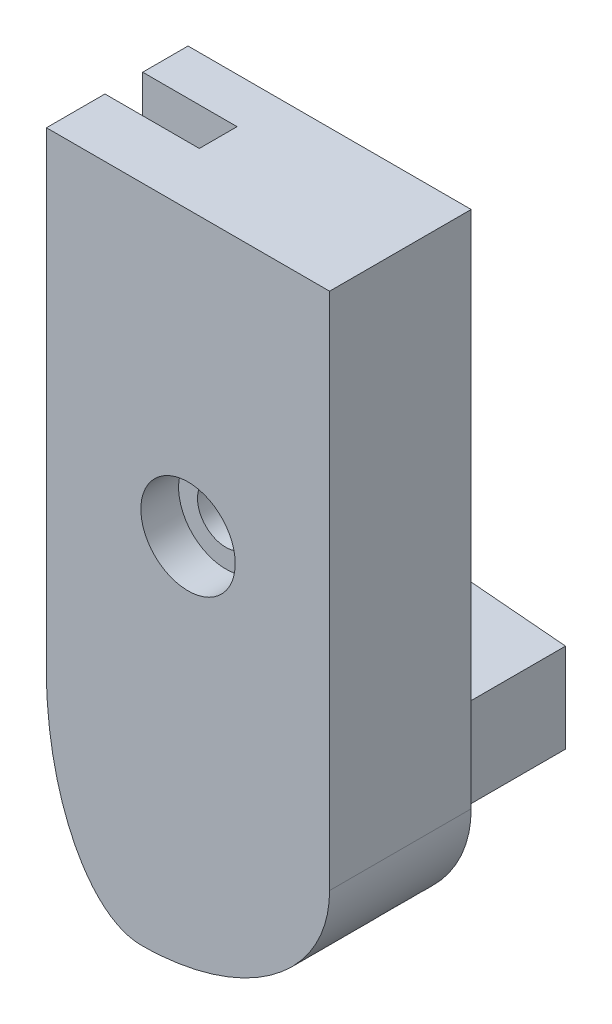
ISO-10303-21;
HEADER;
FILE_DESCRIPTION(('STEP AP214'),'2;1');
FILE_NAME('part.step','',(''),(''),'','','');
FILE_SCHEMA(('AUTOMOTIVE_DESIGN { 1 0 10303 214 1 1 1 1 }'));
ENDSEC;
DATA;
#1=APPLICATION_CONTEXT('core data for automotive mechanical design processes');
#2=APPLICATION_PROTOCOL_DEFINITION('international standard','automotive_design',2000,#1);
#3=PRODUCT_CONTEXT('',#1,'mechanical');
#4=PRODUCT('Part','Part','',(#3));
#5=PRODUCT_RELATED_PRODUCT_CATEGORY('part','',(#4));
#6=PRODUCT_DEFINITION_FORMATION('','',#4);
#7=PRODUCT_DEFINITION_CONTEXT('part definition',#1,'design');
#8=PRODUCT_DEFINITION('design','',#6,#7);
#9=PRODUCT_DEFINITION_SHAPE('','',#8);
#10=(LENGTH_UNIT() NAMED_UNIT(*) SI_UNIT(.MILLI.,.METRE.));
#11=(NAMED_UNIT(*) PLANE_ANGLE_UNIT() SI_UNIT($,.RADIAN.));
#12=(NAMED_UNIT(*) SI_UNIT($,.STERADIAN.) SOLID_ANGLE_UNIT());
#13=UNCERTAINTY_MEASURE_WITH_UNIT(LENGTH_MEASURE(1.E-05),#10,'distance_accuracy_value','');
#14=(GEOMETRIC_REPRESENTATION_CONTEXT(3) GLOBAL_UNCERTAINTY_ASSIGNED_CONTEXT((#13)) GLOBAL_UNIT_ASSIGNED_CONTEXT((#10,
#11,#12)) REPRESENTATION_CONTEXT('',''));
#15=CARTESIAN_POINT('',(0.,0.,0.));
#16=DIRECTION('',(0.,0.,1.));
#17=DIRECTION('',(1.,0.,0.));
#18=AXIS2_PLACEMENT_3D('',#15,#16,#17);
#19=CARTESIAN_POINT('',(-15.,30.,7.5));
#20=DIRECTION('',(1.,0.,0.));
#21=DIRECTION('',(0.,0.,-1.));
#22=AXIS2_PLACEMENT_3D('',#19,#20,#21);
#23=PLANE('',#22);
#24=DIRECTION('',(0.,-1.,0.));
#25=VECTOR('',#24,1.);
#26=CARTESIAN_POINT('',(-15.,30.,-7.5));
#27=LINE('',#26,#25);
#28=CARTESIAN_POINT('',(-15.,-0.0404464860069564,-7.5));
#29=VERTEX_POINT('',#28);
#30=CARTESIAN_POINT('',(-15.,-20.,-7.5));
#31=VERTEX_POINT('',#30);
#32=EDGE_CURVE('E312',#29,#31,#27,.T.);
#33=ORIENTED_EDGE('',*,*,#32,.T.);
#34=CARTESIAN_POINT('',(-15.,-20.,8.25));
#35=CARTESIAN_POINT('',(-15.,-20.,2.74999999999999));
#36=CARTESIAN_POINT('',(-15.,-20.,-2.75));
#37=CARTESIAN_POINT('',(-15.,-20.,-8.25));
#38=CARTESIAN_POINT('',(-15.,-20.,-10.042));
#39=CARTESIAN_POINT('',(-15.,-20.,-11.834));
#40=CARTESIAN_POINT('',(-15.,-20.,-13.626));
#41=(BOUNDED_CURVE() B_SPLINE_CURVE(3,(#34,#35,#36,#37,#38,#39,#40),.UNSPECIFIED.,.F.,
.F.) B_SPLINE_CURVE_WITH_KNOTS((4,3,4),(-0.021126,-0.00462600000000001,0.000750000000000001),
.UNSPECIFIED.) CURVE() GEOMETRIC_REPRESENTATION_ITEM() RATIONAL_B_SPLINE_CURVE((1.,1.,1.,1.,1.,
1.,1.)) REPRESENTATION_ITEM(''));
#42=CARTESIAN_POINT('',(-15.,-20.,-2.69593991600876));
#43=VERTEX_POINT('',#42);
#44=EDGE_CURVE('E643',#31,#43,#41,.F.);
#45=ORIENTED_EDGE('',*,*,#44,.T.);
#46=DIRECTION('',(0.,-1.,0.));
#47=VECTOR('',#46,1.);
#48=CARTESIAN_POINT('',(-15.,30.,-2.69593991600876));
#49=LINE('',#48,#47);
#50=CARTESIAN_POINT('',(-15.,30.,-2.69593991600876));
#51=VERTEX_POINT('',#50);
#52=EDGE_CURVE('E289',#51,#43,#49,.T.);
#53=ORIENTED_EDGE('',*,*,#52,.F.);
#54=DIRECTION('',(0.,0.,-1.));
#55=VECTOR('',#54,1.);
#56=CARTESIAN_POINT('',(-15.,30.,7.5));
#57=LINE('',#56,#55);
#58=CARTESIAN_POINT('',(-15.,30.,-7.5));
#59=VERTEX_POINT('',#58);
#60=EDGE_CURVE('E750',#51,#59,#57,.T.);
#61=ORIENTED_EDGE('',*,*,#60,.T.);
#62=CARTESIAN_POINT('',(-15.,1.36426817366125,-7.5));
#63=VERTEX_POINT('',#62);
#64=EDGE_CURVE('E316',#59,#63,#27,.T.);
#65=ORIENTED_EDGE('',*,*,#64,.T.);
#66=DIRECTION('',(0.,0.,-1.));
#67=VECTOR('',#66,1.);
#68=CARTESIAN_POINT('',(-15.,1.36426817366125,-4.5));
#69=LINE('',#68,#67);
#70=CARTESIAN_POINT('',(-15.,1.36426817366125,-4.5));
#71=VERTEX_POINT('',#70);
#72=EDGE_CURVE('E287',#71,#63,#69,.T.);
#73=ORIENTED_EDGE('',*,*,#72,.F.);
#74=DIRECTION('',(0.,-1.,0.));
#75=VECTOR('',#74,1.);
#76=CARTESIAN_POINT('',(-15.,1.36426817366125,-4.5));
#77=LINE('',#76,#75);
#78=CARTESIAN_POINT('',(-15.,-0.0404464860069564,-4.5));
#79=VERTEX_POINT('',#78);
#80=EDGE_CURVE('E774',#71,#79,#77,.T.);
#81=ORIENTED_EDGE('',*,*,#80,.T.);
#82=DIRECTION('',(0.,0.,-1.));
#83=VECTOR('',#82,1.);
#84=CARTESIAN_POINT('',(-15.,-0.0404464860069564,-4.5));
#85=LINE('',#84,#83);
#86=EDGE_CURVE('E284',#79,#29,#85,.T.);
#87=ORIENTED_EDGE('',*,*,#86,.T.);
#88=EDGE_LOOP('',(#33,#45,#53,#61,#65,#73,#81,#87));
#89=FACE_BOUND('',#88,.T.);
#90=ADVANCED_FACE('F41',(#89),#23,.F.);
#91=CARTESIAN_POINT('',(0.,0.,-7.5));
#92=DIRECTION('',(0.,0.,1.));
#93=DIRECTION('',(1.,0.,0.));
#94=AXIS2_PLACEMENT_3D('',#91,#92,#93);
#95=PLANE('',#94);
#96=DIRECTION('',(0.,1.,0.));
#97=VECTOR('',#96,1.);
#98=CARTESIAN_POINT('',(6.,0.,-7.5));
#99=LINE('',#98,#97);
#100=CARTESIAN_POINT('',(5.9999580452678,-37.5275960949757,-7.5));
#101=VERTEX_POINT('',#100);
#102=CARTESIAN_POINT('',(6.,-24.5713257105763,-7.5));
#103=VERTEX_POINT('',#102);
#104=EDGE_CURVE('E554',#101,#103,#99,.T.);
#105=ORIENTED_EDGE('',*,*,#104,.T.);
#106=DIRECTION('',(-0.996182927064009,0.0872901817284347,0.));
#107=VECTOR('',#106,1.);
#108=CARTESIAN_POINT('',(-2.09093103813967,-23.8623606987456,-7.5));
#109=LINE('',#108,#107);
#110=CARTESIAN_POINT('',(-14.9060970474752,-22.7393825602912,-7.5));
#111=VERTEX_POINT('',#110);
#112=EDGE_CURVE('E637',#103,#111,#109,.T.);
#113=ORIENTED_EDGE('',*,*,#112,.T.);
#114=CARTESIAN_POINT('',(-15.,-20.,-7.5));
#115=CARTESIAN_POINT('',(-15.,-40.,-7.5));
#116=CARTESIAN_POINT('',(-5.,-40.,-7.5));
#117=(BOUNDED_CURVE() B_SPLINE_CURVE(2,(#114,#115,#116),.UNSPECIFIED.,.F.,
.F.) B_SPLINE_CURVE_WITH_KNOTS((3,3),(0.,1.),
.UNSPECIFIED.) CURVE() GEOMETRIC_REPRESENTATION_ITEM() RATIONAL_B_SPLINE_CURVE((1.,
0.707106781186548,1.)) REPRESENTATION_ITEM(''));
#118=EDGE_CURVE('E623',#111,#31,#117,.F.);
#119=ORIENTED_EDGE('',*,*,#118,.T.);
#120=ORIENTED_EDGE('',*,*,#32,.F.);
#121=DIRECTION('',(0.939692620785908,-0.342020143325669,0.));
#122=VECTOR('',#121,1.);
#123=CARTESIAN_POINT('',(0.,-5.5,-7.5));
#124=LINE('',#123,#122);
#125=CARTESIAN_POINT('',(0.,-5.5,-7.5));
#126=VERTEX_POINT('',#125);
#127=EDGE_CURVE('E275',#29,#126,#124,.T.);
#128=ORIENTED_EDGE('',*,*,#127,.T.);
#129=DIRECTION('',(0.,1.,0.));
#130=VECTOR('',#129,1.);
#131=CARTESIAN_POINT('',(0.,-4.09528534033179,-7.5));
#132=LINE('',#131,#130);
#133=CARTESIAN_POINT('',(0.,-5.,-7.5));
#134=VERTEX_POINT('',#133);
#135=EDGE_CURVE('E264',#126,#134,#132,.T.);
#136=ORIENTED_EDGE('',*,*,#135,.T.);
#137=CARTESIAN_POINT('',(0.,0.,-7.5));
#138=DIRECTION('',(0.,0.,1.));
#139=DIRECTION('',(1.,0.,0.));
#140=AXIS2_PLACEMENT_3D('',#137,#138,#139);
#141=CIRCLE('',#140,5.);
#142=CARTESIAN_POINT('',(-4.31594114075766,-2.52441123225108,-7.5));
#143=VERTEX_POINT('',#142);
#144=EDGE_CURVE('E317',#134,#143,#141,.T.);
#145=ORIENTED_EDGE('',*,*,#144,.T.);
#146=DIRECTION('',(-0.939692620785908,0.342020143325669,0.));
#147=VECTOR('',#146,1.);
#148=CARTESIAN_POINT('',(0.,-4.09528534033179,-7.5));
#149=LINE('',#148,#147);
#150=EDGE_CURVE('E267',#143,#63,#149,.T.);
#151=ORIENTED_EDGE('',*,*,#150,.T.);
#152=ORIENTED_EDGE('',*,*,#64,.F.);
#153=DIRECTION('',(1.,0.,0.));
#154=VECTOR('',#153,1.);
#155=CARTESIAN_POINT('',(-15.,30.,-7.5));
#156=LINE('',#155,#154);
#157=CARTESIAN_POINT('',(15.,30.,-7.5));
#158=VERTEX_POINT('',#157);
#159=EDGE_CURVE('E330',#59,#158,#156,.T.);
#160=ORIENTED_EDGE('',*,*,#159,.T.);
#161=DIRECTION('',(0.,-1.,0.));
#162=VECTOR('',#161,1.);
#163=CARTESIAN_POINT('',(15.,30.,-7.5));
#164=LINE('',#163,#162);
#165=CARTESIAN_POINT('',(15.,-25.,-7.5));
#166=VERTEX_POINT('',#165);
#167=EDGE_CURVE('E325',#158,#166,#164,.T.);
#168=ORIENTED_EDGE('',*,*,#167,.T.);
#169=CARTESIAN_POINT('',(-5.,-40.,-7.5));
#170=CARTESIAN_POINT('',(15.,-40.,-7.5));
#171=CARTESIAN_POINT('',(15.,-25.,-7.5));
#172=(BOUNDED_CURVE() B_SPLINE_CURVE(2,(#169,#170,#171),.UNSPECIFIED.,.F.,
.F.) B_SPLINE_CURVE_WITH_KNOTS((3,3),(0.,1.),
.UNSPECIFIED.) CURVE() GEOMETRIC_REPRESENTATION_ITEM() RATIONAL_B_SPLINE_CURVE((1.,
0.707106781186547,1.)) REPRESENTATION_ITEM(''));
#173=EDGE_CURVE('E627',#166,#101,#172,.F.);
#174=ORIENTED_EDGE('',*,*,#173,.T.);
#175=EDGE_LOOP('',(#105,#113,#119,#120,#128,#136,#145,#151,#152,#160,#168,#174));
#176=FACE_BOUND('',#175,.T.);
#177=ADVANCED_FACE('F421',(#176),#95,.F.);
#178=CARTESIAN_POINT('',(0.,0.,19.1694168368741));
#179=DIRECTION('',(0.,0.,1.));
#180=DIRECTION('',(1.,0.,0.));
#181=AXIS2_PLACEMENT_3D('',#178,#179,#180);
#182=CYLINDRICAL_SURFACE('',#181,5.);
#183=CARTESIAN_POINT('',(0.,0.,-3.5));
#184=DIRECTION('',(0.,0.,1.));
#185=DIRECTION('',(1.,0.,0.));
#186=AXIS2_PLACEMENT_3D('',#183,#184,#185);
#187=CIRCLE('',#186,5.);
#188=CARTESIAN_POINT('',(5.,0.,-3.5));
#189=VERTEX_POINT('',#188);
#190=EDGE_CURVE('E349',#189,#189,#187,.T.);
#191=ORIENTED_EDGE('',*,*,#190,.T.);
#192=EDGE_LOOP('',(#191));
#193=FACE_BOUND('',#192,.T.);
#194=DIRECTION('',(0.,0.,1.));
#195=VECTOR('',#194,1.);
#196=CARTESIAN_POINT('',(0.,-5.,19.1694168368741));
#197=LINE('',#196,#195);
#198=CARTESIAN_POINT('',(0.,-5.,-4.5));
#199=VERTEX_POINT('',#198);
#200=EDGE_CURVE('E714',#199,#134,#197,.F.);
#201=ORIENTED_EDGE('',*,*,#200,.F.);
#202=CARTESIAN_POINT('',(0.,0.,-4.5));
#203=DIRECTION('',(0.,0.,-1.));
#204=DIRECTION('',(-1.,0.,0.));
#205=AXIS2_PLACEMENT_3D('',#202,#203,#204);
#206=CIRCLE('',#205,5.);
#207=CARTESIAN_POINT('',(-4.31594114075766,-2.52441123225108,-4.5));
#208=VERTEX_POINT('',#207);
#209=EDGE_CURVE('E758',#208,#199,#206,.F.);
#210=ORIENTED_EDGE('',*,*,#209,.F.);
#211=DIRECTION('',(0.,0.,1.));
#212=VECTOR('',#211,1.);
#213=CARTESIAN_POINT('',(-4.31594114075766,-2.52441123225108,19.1694168368741));
#214=LINE('',#213,#212);
#215=EDGE_CURVE('E760',#143,#208,#214,.T.);
#216=ORIENTED_EDGE('',*,*,#215,.F.);
#217=ORIENTED_EDGE('',*,*,#144,.F.);
#218=EDGE_LOOP('',(#201,#210,#216,#217));
#219=FACE_BOUND('',#218,.T.);
#220=ADVANCED_FACE('F417',(#193,#219),#182,.F.);
#221=DIRECTION('',(0.,1.,0.));
#222=VECTOR('',#221,1.);
#223=CARTESIAN_POINT('',(-15.,30.,1.30406008399123));
#224=LINE('',#223,#222);
#225=CARTESIAN_POINT('',(-15.,-20.,1.30406008399124));
#226=VERTEX_POINT('',#225);
#227=CARTESIAN_POINT('',(-15.,30.,1.30406008399123));
#228=VERTEX_POINT('',#227);
#229=EDGE_CURVE('E294',#226,#228,#224,.T.);
#230=ORIENTED_EDGE('',*,*,#229,.F.);
#231=CARTESIAN_POINT('',(-15.,-20.,8.25));
#232=CARTESIAN_POINT('',(-15.,-20.,2.74999999999999));
#233=CARTESIAN_POINT('',(-15.,-20.,-2.75));
#234=CARTESIAN_POINT('',(-15.,-20.,-8.25));
#235=CARTESIAN_POINT('',(-15.,-20.,-10.042));
#236=CARTESIAN_POINT('',(-15.,-20.,-11.834));
#237=CARTESIAN_POINT('',(-15.,-20.,-13.626));
#238=(BOUNDED_CURVE() B_SPLINE_CURVE(3,(#231,#232,#233,#234,#235,#236,#237),.UNSPECIFIED.,.F.,
.F.) B_SPLINE_CURVE_WITH_KNOTS((4,3,4),(-0.021126,-0.00462600000000001,0.000750000000000001),
.UNSPECIFIED.) CURVE() GEOMETRIC_REPRESENTATION_ITEM() RATIONAL_B_SPLINE_CURVE((1.,1.,1.,1.,1.,
1.,1.)) REPRESENTATION_ITEM(''));
#239=CARTESIAN_POINT('',(-15.,-20.,7.5));
#240=VERTEX_POINT('',#239);
#241=EDGE_CURVE('E648',#226,#240,#238,.F.);
#242=ORIENTED_EDGE('',*,*,#241,.T.);
#243=DIRECTION('',(0.,-1.,0.));
#244=VECTOR('',#243,1.);
#245=CARTESIAN_POINT('',(-15.,30.,7.5));
#246=LINE('',#245,#244);
#247=CARTESIAN_POINT('',(-15.,30.,7.5));
#248=VERTEX_POINT('',#247);
#249=EDGE_CURVE('E318',#248,#240,#246,.T.);
#250=ORIENTED_EDGE('',*,*,#249,.F.);
#251=EDGE_CURVE('E709',#248,#228,#57,.T.);
#252=ORIENTED_EDGE('',*,*,#251,.T.);
#253=EDGE_LOOP('',(#230,#242,#250,#252));
#254=FACE_BOUND('',#253,.T.);
#255=ADVANCED_FACE('F420',(#254),#23,.F.);
#256=CARTESIAN_POINT('',(15.,30.,7.5));
#257=DIRECTION('',(1.,0.,0.));
#258=DIRECTION('',(0.,0.,-1.));
#259=AXIS2_PLACEMENT_3D('',#256,#257,#258);
#260=PLANE('',#259);
#261=DIRECTION('',(0.,-1.,0.));
#262=VECTOR('',#261,1.);
#263=CARTESIAN_POINT('',(15.,30.,7.5));
#264=LINE('',#263,#262);
#265=CARTESIAN_POINT('',(15.,30.,7.5));
#266=VERTEX_POINT('',#265);
#267=CARTESIAN_POINT('',(15.,-25.,7.5));
#268=VERTEX_POINT('',#267);
#269=EDGE_CURVE('E340',#266,#268,#264,.T.);
#270=ORIENTED_EDGE('',*,*,#269,.T.);
#271=CARTESIAN_POINT('',(15.,-25.,-34.5));
#272=CARTESIAN_POINT('',(15.,-25.,-19.8333333333334));
#273=CARTESIAN_POINT('',(15.,-25.,-5.16666666666665));
#274=CARTESIAN_POINT('',(15.,-25.,9.5));
#275=(BOUNDED_CURVE() B_SPLINE_CURVE(3,(#271,#272,#273,#274),.UNSPECIFIED.,.F.,
.F.) B_SPLINE_CURVE_WITH_KNOTS((4,4),(-0.042,0.002),
.UNSPECIFIED.) CURVE() GEOMETRIC_REPRESENTATION_ITEM() RATIONAL_B_SPLINE_CURVE((1.,1.,1.,1.)) REPRESENTATION_ITEM(''));
#276=EDGE_CURVE('E626',#268,#166,#275,.F.);
#277=ORIENTED_EDGE('',*,*,#276,.T.);
#278=ORIENTED_EDGE('',*,*,#167,.F.);
#279=DIRECTION('',(0.,0.,-1.));
#280=VECTOR('',#279,1.);
#281=CARTESIAN_POINT('',(15.,30.,7.5));
#282=LINE('',#281,#280);
#283=EDGE_CURVE('E754',#266,#158,#282,.T.);
#284=ORIENTED_EDGE('',*,*,#283,.F.);
#285=EDGE_LOOP('',(#270,#277,#278,#284));
#286=FACE_BOUND('',#285,.T.);
#287=ADVANCED_FACE('F703',(#286),#260,.T.);
#288=CARTESIAN_POINT('',(-15.,30.,7.5));
#289=DIRECTION('',(0.,1.,0.));
#290=DIRECTION('',(0.,0.,1.));
#291=AXIS2_PLACEMENT_3D('',#288,#289,#290);
#292=PLANE('',#291);
#293=DIRECTION('',(-1.,0.,0.));
#294=VECTOR('',#293,1.);
#295=CARTESIAN_POINT('',(-5.00000000000001,30.,-2.69593991600876));
#296=LINE('',#295,#294);
#297=CARTESIAN_POINT('',(-5.00000000000001,30.,-2.69593991600876));
#298=VERTEX_POINT('',#297);
#299=EDGE_CURVE('E364',#298,#51,#296,.T.);
#300=ORIENTED_EDGE('',*,*,#299,.F.);
#301=DIRECTION('',(0.,0.,-1.));
#302=VECTOR('',#301,1.);
#303=CARTESIAN_POINT('',(-5.00000000000001,30.,-2.69593991600876));
#304=LINE('',#303,#302);
#305=CARTESIAN_POINT('',(-5.00000000000001,30.,1.30406008399124));
#306=VERTEX_POINT('',#305);
#307=EDGE_CURVE('E299',#306,#298,#304,.T.);
#308=ORIENTED_EDGE('',*,*,#307,.F.);
#309=DIRECTION('',(-1.,0.,0.));
#310=VECTOR('',#309,1.);
#311=CARTESIAN_POINT('',(-5.00000000000001,30.,1.30406008399123));
#312=LINE('',#311,#310);
#313=EDGE_CURVE('E745',#306,#228,#312,.T.);
#314=ORIENTED_EDGE('',*,*,#313,.T.);
#315=ORIENTED_EDGE('',*,*,#251,.F.);
#316=DIRECTION('',(1.,0.,0.));
#317=VECTOR('',#316,1.);
#318=CARTESIAN_POINT('',(-15.,30.,7.5));
#319=LINE('',#318,#317);
#320=EDGE_CURVE('E326',#248,#266,#319,.T.);
#321=ORIENTED_EDGE('',*,*,#320,.T.);
#322=ORIENTED_EDGE('',*,*,#283,.T.);
#323=ORIENTED_EDGE('',*,*,#159,.F.);
#324=ORIENTED_EDGE('',*,*,#60,.F.);
#325=EDGE_LOOP('',(#300,#308,#314,#315,#321,#322,#323,#324));
#326=FACE_BOUND('',#325,.T.);
#327=ADVANCED_FACE('F426',(#326),#292,.T.);
#328=CARTESIAN_POINT('',(0.,0.,7.5));
#329=DIRECTION('',(0.,0.,1.));
#330=DIRECTION('',(1.,0.,0.));
#331=AXIS2_PLACEMENT_3D('',#328,#329,#330);
#332=PLANE('',#331);
#333=CARTESIAN_POINT('',(0.,0.,7.5));
#334=DIRECTION('',(0.,0.,1.));
#335=DIRECTION('',(1.,0.,0.));
#336=AXIS2_PLACEMENT_3D('',#333,#334,#335);
#337=CIRCLE('',#336,5.);
#338=CARTESIAN_POINT('',(5.,0.,7.5));
#339=VERTEX_POINT('',#338);
#340=EDGE_CURVE('E361',#339,#339,#337,.T.);
#341=ORIENTED_EDGE('',*,*,#340,.F.);
#342=EDGE_LOOP('',(#341));
#343=FACE_BOUND('',#342,.T.);
#344=CARTESIAN_POINT('',(-5.,-40.,7.5));
#345=CARTESIAN_POINT('',(-15.,-40.,7.5));
#346=CARTESIAN_POINT('',(-15.,-20.,7.5));
#347=(BOUNDED_CURVE() B_SPLINE_CURVE(2,(#344,#345,#346),.UNSPECIFIED.,.F.,
.F.) B_SPLINE_CURVE_WITH_KNOTS((3,3),(0.,1.),
.UNSPECIFIED.) CURVE() GEOMETRIC_REPRESENTATION_ITEM() RATIONAL_B_SPLINE_CURVE((1.,
0.707106781186548,1.)) REPRESENTATION_ITEM(''));
#348=CARTESIAN_POINT('',(-5.,-40.,7.5));
#349=VERTEX_POINT('',#348);
#350=EDGE_CURVE('E612',#240,#349,#347,.F.);
#351=ORIENTED_EDGE('',*,*,#350,.T.);
#352=CARTESIAN_POINT('',(15.,-25.,7.5));
#353=CARTESIAN_POINT('',(15.,-40.,7.5));
#354=CARTESIAN_POINT('',(-5.,-40.,7.5));
#355=(BOUNDED_CURVE() B_SPLINE_CURVE(2,(#352,#353,#354),.UNSPECIFIED.,.F.,
.F.) B_SPLINE_CURVE_WITH_KNOTS((3,3),(0.,1.),
.UNSPECIFIED.) CURVE() GEOMETRIC_REPRESENTATION_ITEM() RATIONAL_B_SPLINE_CURVE((1.,
0.707106781186547,1.)) REPRESENTATION_ITEM(''));
#356=EDGE_CURVE('E562',#349,#268,#355,.F.);
#357=ORIENTED_EDGE('',*,*,#356,.T.);
#358=ORIENTED_EDGE('',*,*,#269,.F.);
#359=ORIENTED_EDGE('',*,*,#320,.F.);
#360=ORIENTED_EDGE('',*,*,#249,.T.);
#361=EDGE_LOOP('',(#351,#357,#358,#359,#360));
#362=FACE_BOUND('',#361,.T.);
#363=ADVANCED_FACE('F415',(#343,#362),#332,.T.);
#364=CARTESIAN_POINT('',(0.,-3.,-3.5));
#365=DIRECTION('',(0.,0.,1.));
#366=DIRECTION('',(1.,0.,0.));
#367=AXIS2_PLACEMENT_3D('',#364,#365,#366);
#368=PLANE('',#367);
#369=ORIENTED_EDGE('',*,*,#190,.F.);
#370=EDGE_LOOP('',(#369));
#371=FACE_BOUND('',#370,.T.);
#372=CARTESIAN_POINT('',(0.,0.,-3.5));
#373=DIRECTION('',(0.,0.,1.));
#374=DIRECTION('',(1.,0.,0.));
#375=AXIS2_PLACEMENT_3D('',#372,#373,#374);
#376=CIRCLE('',#375,3.);
#377=CARTESIAN_POINT('',(3.,0.,-3.5));
#378=VERTEX_POINT('',#377);
#379=EDGE_CURVE('E352',#378,#378,#376,.T.);
#380=ORIENTED_EDGE('',*,*,#379,.T.);
#381=EDGE_LOOP('',(#380));
#382=FACE_BOUND('',#381,.T.);
#383=ADVANCED_FACE('F411',(#371,#382),#368,.F.);
#384=CARTESIAN_POINT('',(0.,0.,19.1694168368741));
#385=DIRECTION('',(0.,0.,1.));
#386=DIRECTION('',(1.,0.,0.));
#387=AXIS2_PLACEMENT_3D('',#384,#385,#386);
#388=CYLINDRICAL_SURFACE('',#387,3.);
#389=ORIENTED_EDGE('',*,*,#379,.F.);
#390=EDGE_LOOP('',(#389));
#391=FACE_BOUND('',#390,.T.);
#392=CARTESIAN_POINT('',(0.,0.,3.5));
#393=DIRECTION('',(0.,0.,1.));
#394=DIRECTION('',(1.,0.,0.));
#395=AXIS2_PLACEMENT_3D('',#392,#393,#394);
#396=CIRCLE('',#395,3.);
#397=CARTESIAN_POINT('',(3.,0.,3.5));
#398=VERTEX_POINT('',#397);
#399=EDGE_CURVE('E355',#398,#398,#396,.T.);
#400=ORIENTED_EDGE('',*,*,#399,.T.);
#401=EDGE_LOOP('',(#400));
#402=FACE_BOUND('',#401,.T.);
#403=ADVANCED_FACE('F407',(#391,#402),#388,.F.);
#404=CARTESIAN_POINT('',(0.,-5.,3.5));
#405=DIRECTION('',(0.,0.,-1.));
#406=DIRECTION('',(-1.,0.,0.));
#407=AXIS2_PLACEMENT_3D('',#404,#405,#406);
#408=PLANE('',#407);
#409=ORIENTED_EDGE('',*,*,#399,.F.);
#410=EDGE_LOOP('',(#409));
#411=FACE_BOUND('',#410,.T.);
#412=CARTESIAN_POINT('',(0.,0.,3.5));
#413=DIRECTION('',(0.,0.,1.));
#414=DIRECTION('',(1.,0.,0.));
#415=AXIS2_PLACEMENT_3D('',#412,#413,#414);
#416=CIRCLE('',#415,5.);
#417=CARTESIAN_POINT('',(5.,0.,3.5));
#418=VERTEX_POINT('',#417);
#419=EDGE_CURVE('E358',#418,#418,#416,.T.);
#420=ORIENTED_EDGE('',*,*,#419,.T.);
#421=EDGE_LOOP('',(#420));
#422=FACE_BOUND('',#421,.T.);
#423=ADVANCED_FACE('F403',(#411,#422),#408,.F.);
#424=CARTESIAN_POINT('',(0.,0.,19.1694168368741));
#425=DIRECTION('',(0.,0.,1.));
#426=DIRECTION('',(1.,0.,0.));
#427=AXIS2_PLACEMENT_3D('',#424,#425,#426);
#428=CYLINDRICAL_SURFACE('',#427,5.);
#429=ORIENTED_EDGE('',*,*,#419,.F.);
#430=EDGE_LOOP('',(#429));
#431=FACE_BOUND('',#430,.T.);
#432=ORIENTED_EDGE('',*,*,#340,.T.);
#433=EDGE_LOOP('',(#432));
#434=FACE_BOUND('',#433,.T.);
#435=ADVANCED_FACE('F398',(#431,#434),#428,.F.);
#436=CARTESIAN_POINT('',(-5.00000000000001,30.,-2.69593991600876));
#437=DIRECTION('',(0.,0.,-1.));
#438=DIRECTION('',(-1.,0.,0.));
#439=AXIS2_PLACEMENT_3D('',#436,#437,#438);
#440=PLANE('',#439);
#441=ORIENTED_EDGE('',*,*,#52,.T.);
#442=CARTESIAN_POINT('',(-5.,-40.,-2.69593991600876));
#443=CARTESIAN_POINT('',(-15.,-40.,-2.69593991600877));
#444=CARTESIAN_POINT('',(-15.,-20.,-2.69593991600876));
#445=(BOUNDED_CURVE() B_SPLINE_CURVE(2,(#442,#443,#444),.UNSPECIFIED.,.F.,
.F.) B_SPLINE_CURVE_WITH_KNOTS((3,3),(0.,1.),
.UNSPECIFIED.) CURVE() GEOMETRIC_REPRESENTATION_ITEM() RATIONAL_B_SPLINE_CURVE((1.,
0.707106781186548,1.)) REPRESENTATION_ITEM(''));
#446=CARTESIAN_POINT('',(-13.6602540378444,-30.,-2.69593991600876));
#447=VERTEX_POINT('',#446);
#448=EDGE_CURVE('E381',#43,#447,#445,.F.);
#449=ORIENTED_EDGE('',*,*,#448,.T.);
#450=DIRECTION('',(-1.,0.,0.));
#451=VECTOR('',#450,1.);
#452=CARTESIAN_POINT('',(-4.99999999999999,-30.,-2.69593991600876));
#453=LINE('',#452,#451);
#454=CARTESIAN_POINT('',(-4.99999999999999,-30.,-2.69593991600876));
#455=VERTEX_POINT('',#454);
#456=EDGE_CURVE('E302',#455,#447,#453,.T.);
#457=ORIENTED_EDGE('',*,*,#456,.F.);
#458=DIRECTION('',(0.,-1.,0.));
#459=VECTOR('',#458,1.);
#460=CARTESIAN_POINT('',(-5.00000000000001,30.,-2.69593991600876));
#461=LINE('',#460,#459);
#462=EDGE_CURVE('E290',#298,#455,#461,.T.);
#463=ORIENTED_EDGE('',*,*,#462,.F.);
#464=ORIENTED_EDGE('',*,*,#299,.T.);
#465=EDGE_LOOP('',(#441,#449,#457,#463,#464));
#466=FACE_BOUND('',#465,.T.);
#467=ADVANCED_FACE('F387',(#466),#440,.F.);
#468=CARTESIAN_POINT('',(-5.00000000000001,30.,1.30406008399123));
#469=DIRECTION('',(0.,0.,1.));
#470=DIRECTION('',(0.,-1.,0.));
#471=AXIS2_PLACEMENT_3D('',#468,#469,#470);
#472=PLANE('',#471);
#473=DIRECTION('',(-1.,0.,0.));
#474=VECTOR('',#473,1.);
#475=CARTESIAN_POINT('',(-4.99999999999999,-30.,1.30406008399124));
#476=LINE('',#475,#474);
#477=CARTESIAN_POINT('',(-4.99999999999999,-30.,1.30406008399124));
#478=VERTEX_POINT('',#477);
#479=CARTESIAN_POINT('',(-13.6602540378444,-30.,1.30406008399124));
#480=VERTEX_POINT('',#479);
#481=EDGE_CURVE('E373',#478,#480,#476,.T.);
#482=ORIENTED_EDGE('',*,*,#481,.T.);
#483=CARTESIAN_POINT('',(-15.,-20.,1.30406008399124));
#484=CARTESIAN_POINT('',(-15.,-40.,1.30406008399124));
#485=CARTESIAN_POINT('',(-5.,-40.,1.30406008399124));
#486=(BOUNDED_CURVE() B_SPLINE_CURVE(2,(#483,#484,#485),.UNSPECIFIED.,.F.,
.F.) B_SPLINE_CURVE_WITH_KNOTS((3,3),(0.,1.),
.UNSPECIFIED.) CURVE() GEOMETRIC_REPRESENTATION_ITEM() RATIONAL_B_SPLINE_CURVE((1.,
0.707106781186548,1.)) REPRESENTATION_ITEM(''));
#487=EDGE_CURVE('E600',#480,#226,#486,.F.);
#488=ORIENTED_EDGE('',*,*,#487,.T.);
#489=ORIENTED_EDGE('',*,*,#229,.T.);
#490=ORIENTED_EDGE('',*,*,#313,.F.);
#491=DIRECTION('',(0.,1.,0.));
#492=VECTOR('',#491,1.);
#493=CARTESIAN_POINT('',(-5.00000000000001,30.,1.30406008399123));
#494=LINE('',#493,#492);
#495=EDGE_CURVE('E297',#478,#306,#494,.T.);
#496=ORIENTED_EDGE('',*,*,#495,.F.);
#497=EDGE_LOOP('',(#482,#488,#489,#490,#496));
#498=FACE_BOUND('',#497,.T.);
#499=ADVANCED_FACE('F397',(#498),#472,.F.);
#500=CARTESIAN_POINT('',(-5.,0.,0.));
#501=DIRECTION('',(-1.,0.,0.));
#502=DIRECTION('',(0.,-1.,0.));
#503=AXIS2_PLACEMENT_3D('',#500,#501,#502);
#504=PLANE('',#503);
#505=ORIENTED_EDGE('',*,*,#462,.T.);
#506=DIRECTION('',(0.,0.,1.));
#507=VECTOR('',#506,1.);
#508=CARTESIAN_POINT('',(-4.99999999999999,-30.,-2.69593991600876));
#509=LINE('',#508,#507);
#510=EDGE_CURVE('E293',#455,#478,#509,.T.);
#511=ORIENTED_EDGE('',*,*,#510,.T.);
#512=ORIENTED_EDGE('',*,*,#495,.T.);
#513=ORIENTED_EDGE('',*,*,#307,.T.);
#514=EDGE_LOOP('',(#505,#511,#512,#513));
#515=FACE_BOUND('',#514,.T.);
#516=ADVANCED_FACE('F788',(#515),#504,.T.);
#517=CARTESIAN_POINT('',(0.,-4.09528534033179,-4.5));
#518=DIRECTION('',(-1.,0.,0.));
#519=DIRECTION('',(0.,0.,1.));
#520=AXIS2_PLACEMENT_3D('',#517,#518,#519);
#521=PLANE('',#520);
#522=ORIENTED_EDGE('',*,*,#200,.T.);
#523=ORIENTED_EDGE('',*,*,#135,.F.);
#524=DIRECTION('',(0.,0.,-1.));
#525=VECTOR('',#524,1.);
#526=CARTESIAN_POINT('',(0.,-5.5,-4.5));
#527=LINE('',#526,#525);
#528=CARTESIAN_POINT('',(0.,-5.5,-4.5));
#529=VERTEX_POINT('',#528);
#530=EDGE_CURVE('E282',#529,#126,#527,.T.);
#531=ORIENTED_EDGE('',*,*,#530,.F.);
#532=DIRECTION('',(0.,1.,0.));
#533=VECTOR('',#532,1.);
#534=CARTESIAN_POINT('',(0.,-4.09528534033179,-4.5));
#535=LINE('',#534,#533);
#536=EDGE_CURVE('E220',#529,#199,#535,.T.);
#537=ORIENTED_EDGE('',*,*,#536,.T.);
#538=EDGE_LOOP('',(#522,#523,#531,#537));
#539=FACE_BOUND('',#538,.T.);
#540=ADVANCED_FACE('F765',(#539),#521,.T.);
#541=CARTESIAN_POINT('',(0.,-4.09528534033179,-4.5));
#542=DIRECTION('',(-0.342020143325669,-0.939692620785908,0.));
#543=DIRECTION('',(0.939692620785908,-0.342020143325669,0.));
#544=AXIS2_PLACEMENT_3D('',#541,#542,#543);
#545=PLANE('',#544);
#546=ORIENTED_EDGE('',*,*,#215,.T.);
#547=DIRECTION('',(-0.939692620785908,0.342020143325669,0.));
#548=VECTOR('',#547,1.);
#549=CARTESIAN_POINT('',(0.,-4.09528534033179,-4.5));
#550=LINE('',#549,#548);
#551=EDGE_CURVE('E776',#208,#71,#550,.T.);
#552=ORIENTED_EDGE('',*,*,#551,.T.);
#553=ORIENTED_EDGE('',*,*,#72,.T.);
#554=ORIENTED_EDGE('',*,*,#150,.F.);
#555=EDGE_LOOP('',(#546,#552,#553,#554));
#556=FACE_BOUND('',#555,.T.);
#557=ADVANCED_FACE('F775',(#556),#545,.T.);
#558=CARTESIAN_POINT('',(0.,0.,-4.5));
#559=DIRECTION('',(0.,0.,-1.));
#560=DIRECTION('',(-1.,0.,0.));
#561=AXIS2_PLACEMENT_3D('',#558,#559,#560);
#562=PLANE('',#561);
#563=ORIENTED_EDGE('',*,*,#209,.T.);
#564=ORIENTED_EDGE('',*,*,#536,.F.);
#565=DIRECTION('',(0.939692620785908,-0.342020143325669,0.));
#566=VECTOR('',#565,1.);
#567=CARTESIAN_POINT('',(0.,-5.5,-4.5));
#568=LINE('',#567,#566);
#569=EDGE_CURVE('E278',#79,#529,#568,.T.);
#570=ORIENTED_EDGE('',*,*,#569,.F.);
#571=ORIENTED_EDGE('',*,*,#80,.F.);
#572=ORIENTED_EDGE('',*,*,#551,.F.);
#573=EDGE_LOOP('',(#563,#564,#570,#571,#572));
#574=FACE_BOUND('',#573,.T.);
#575=ADVANCED_FACE('F585',(#574),#562,.T.);
#576=CARTESIAN_POINT('',(0.,-5.5,-4.5));
#577=DIRECTION('',(0.342020143325669,0.939692620785908,0.));
#578=DIRECTION('',(-0.939692620785908,0.342020143325669,0.));
#579=AXIS2_PLACEMENT_3D('',#576,#577,#578);
#580=PLANE('',#579);
#581=ORIENTED_EDGE('',*,*,#127,.F.);
#582=ORIENTED_EDGE('',*,*,#86,.F.);
#583=ORIENTED_EDGE('',*,*,#569,.T.);
#584=ORIENTED_EDGE('',*,*,#530,.T.);
#585=EDGE_LOOP('',(#581,#582,#583,#584));
#586=FACE_BOUND('',#585,.T.);
#587=ADVANCED_FACE('F583',(#586),#580,.T.);
#588=CARTESIAN_POINT('',(0.,-30.,0.));
#589=DIRECTION('',(0.,1.,0.));
#590=DIRECTION('',(0.,0.,1.));
#591=AXIS2_PLACEMENT_3D('',#588,#589,#590);
#592=PLANE('',#591);
#593=ORIENTED_EDGE('',*,*,#456,.T.);
#594=CARTESIAN_POINT('',(-13.6602540378444,-30.,8.25));
#595=CARTESIAN_POINT('',(-13.6602540378444,-30.,2.75));
#596=CARTESIAN_POINT('',(-13.6602540378444,-30.,-2.75));
#597=CARTESIAN_POINT('',(-13.6602540378444,-30.,-8.25));
#598=CARTESIAN_POINT('',(-13.6602540378444,-30.,-10.042));
#599=CARTESIAN_POINT('',(-13.6602540378444,-30.,-11.834));
#600=CARTESIAN_POINT('',(-13.6602540378444,-30.,-13.626));
#601=(BOUNDED_CURVE() B_SPLINE_CURVE(3,(#594,#595,#596,#597,#598,#599,#600),.UNSPECIFIED.,.F.,
.F.) B_SPLINE_CURVE_WITH_KNOTS((4,3,4),(-0.021126,-0.00462600000000001,0.000750000000000001),
.UNSPECIFIED.) CURVE() GEOMETRIC_REPRESENTATION_ITEM() RATIONAL_B_SPLINE_CURVE((0.868347502412604,
0.868347502412604,0.868347502412604,0.868347502412604,0.868347502412604,0.868347502412604,0.868347502412604)) REPRESENTATION_ITEM(''));
#602=EDGE_CURVE('E736',#447,#480,#601,.F.);
#603=ORIENTED_EDGE('',*,*,#602,.T.);
#604=ORIENTED_EDGE('',*,*,#481,.F.);
#605=ORIENTED_EDGE('',*,*,#510,.F.);
#606=EDGE_LOOP('',(#593,#603,#604,#605));
#607=FACE_BOUND('',#606,.T.);
#608=ADVANCED_FACE('F579',(#607),#592,.T.);
#609=CARTESIAN_POINT('',(-15.,-20.,-13.626));
#610=CARTESIAN_POINT('',(-15.,-20.,-11.834));
#611=CARTESIAN_POINT('',(-15.,-20.,-10.042));
#612=CARTESIAN_POINT('',(-15.,-20.,-8.25));
#613=CARTESIAN_POINT('',(-15.,-20.,-2.75));
#614=CARTESIAN_POINT('',(-15.,-20.,2.74999999999999));
#615=CARTESIAN_POINT('',(-15.,-20.,8.25));
#616=CARTESIAN_POINT('',(-15.,-40.,-13.626));
#617=CARTESIAN_POINT('',(-15.,-40.,-11.834));
#618=CARTESIAN_POINT('',(-15.,-40.,-10.042));
#619=CARTESIAN_POINT('',(-15.,-40.,-8.25));
#620=CARTESIAN_POINT('',(-15.,-40.,-2.75000000000001));
#621=CARTESIAN_POINT('',(-15.,-40.,2.75));
#622=CARTESIAN_POINT('',(-15.,-40.,8.25));
#623=CARTESIAN_POINT('',(-5.,-40.,-13.626));
#624=CARTESIAN_POINT('',(-5.,-40.,-11.834));
#625=CARTESIAN_POINT('',(-5.,-40.,-10.042));
#626=CARTESIAN_POINT('',(-5.,-40.,-8.25));
#627=CARTESIAN_POINT('',(-5.,-40.,-2.75));
#628=CARTESIAN_POINT('',(-5.,-40.,2.74999999999999));
#629=CARTESIAN_POINT('',(-5.,-40.,8.25));
#630=(BOUNDED_SURFACE() B_SPLINE_SURFACE(2,3,((#609,#610,#611,#612,#613,#614,#615),(#616,#617,
#618,#619,#620,#621,#622),(#623,#624,#625,#626,#627,#628,#629)),.UNSPECIFIED.,.F.,.F.,
.F.) B_SPLINE_SURFACE_WITH_KNOTS((3,3),(4,3,4),(0.,1.),(-0.021126,-0.01575,0.00075),
.UNSPECIFIED.) GEOMETRIC_REPRESENTATION_ITEM() RATIONAL_B_SPLINE_SURFACE(((1.,1.,1.,1.,1.,1.,
1.),(0.707106781186548,0.707106781186548,0.707106781186548,0.707106781186548,0.707106781186548,
0.707106781186548,0.707106781186548),(1.,1.,1.,1.,1.,1.,1.))) REPRESENTATION_ITEM('') SURFACE());
#631=CARTESIAN_POINT('',(-5.,-40.,-7.5));
#632=CARTESIAN_POINT('',(-6.47561040585266,-40.,-7.5));
#633=CARTESIAN_POINT('',(-7.88897176730374,-39.1472026288669,-7.5));
#634=CARTESIAN_POINT('',(-9.08374179686184,-38.4262994203133,-7.5));
#635=CARTESIAN_POINT('',(-10.1542497232227,-37.138694208213,-7.5));
#636=CARTESIAN_POINT('',(-11.8677027195201,-35.0777557000589,-7.5));
#637=CARTESIAN_POINT('',(-13.0536044166307,-31.8557084816433,-7.5));
#638=CARTESIAN_POINT('',(-13.5815987823877,-30.421169023886,-7.5));
#639=CARTESIAN_POINT('',(-13.9700804598898,-28.8444445644303,-7.5));
#640=B_SPLINE_CURVE_WITH_KNOTS('',2,(#631,#632,#633,#634,#635,#636,#637,#638,#639),
.UNSPECIFIED.,.F.,.F.,(3,2,2,2,3),(0.,0.125,0.25,0.5,0.633954118810359),.UNSPECIFIED.);
#641=CARTESIAN_POINT('',(-5.,-40.,-7.5));
#642=VERTEX_POINT('',#641);
#643=CARTESIAN_POINT('',(-13.9695971850549,-28.8443253639511,-7.5));
#644=VERTEX_POINT('',#643);
#645=EDGE_CURVE('E215',#642,#644,#640,.T.);
#646=CARTESIAN_POINT('',(-5.,-40.,9.5));
#647=CARTESIAN_POINT('',(-5.,-40.,-5.16666666666665));
#648=CARTESIAN_POINT('',(-5.,-40.,-19.8333333333334));
#649=CARTESIAN_POINT('',(-5.,-40.,-34.5));
#650=(BOUNDED_CURVE() B_SPLINE_CURVE(3,(#646,#647,#648,#649),.UNSPECIFIED.,.F.,
.F.) B_SPLINE_CURVE_WITH_KNOTS((4,4),(-0.042,0.002),
.UNSPECIFIED.) CURVE() GEOMETRIC_REPRESENTATION_ITEM() RATIONAL_B_SPLINE_CURVE((1.,1.,1.,1.)) REPRESENTATION_ITEM(''));
#651=EDGE_CURVE('E620',#349,#642,#650,.T.);
#652=CARTESIAN_POINT('',(-14.9057548000757,-22.739358932872,-7.50000000095214));
#653=CARTESIAN_POINT('',(-14.893768888756,-22.9128894137912,-7.499979019964));
#654=CARTESIAN_POINT('',(-14.8806056546493,-23.0863269876393,-7.50737359593847));
#655=CARTESIAN_POINT('',(-14.8520746152721,-23.4317492272564,-7.53676562878737));
#656=CARTESIAN_POINT('',(-14.836707188386,-23.603734137043,-7.55876058162446));
#657=CARTESIAN_POINT('',(-14.8039359337088,-23.9448121388593,-7.6170855813952));
#658=CARTESIAN_POINT('',(-14.7865349048293,-24.113908846804,-7.65339608511216));
#659=CARTESIAN_POINT('',(-14.7498988365263,-24.4482770118593,-7.74001490182318));
#660=CARTESIAN_POINT('',(-14.7306637547499,-24.6135483805236,-7.79032353812095));
#661=CARTESIAN_POINT('',(-14.6906345447227,-24.9390789779705,-7.90451169104945));
#662=CARTESIAN_POINT('',(-14.6698409057926,-25.0993397576575,-7.96838695978751));
#663=CARTESIAN_POINT('',(-14.6269996569058,-25.413879406608,-8.10926623921624));
#664=CARTESIAN_POINT('',(-14.6049515884102,-25.5681560533502,-8.18627507150801));
#665=CARTESIAN_POINT('',(-14.5599756778626,-25.8695994744526,-8.3528519837444));
#666=CARTESIAN_POINT('',(-14.5370480032469,-26.0167675900173,-8.44241768197467));
#667=CARTESIAN_POINT('',(-14.4907037517966,-26.3030803229831,-8.6335590381778));
#668=CARTESIAN_POINT('',(-14.4672870071535,-26.4422221226992,-8.73513887606867));
#669=CARTESIAN_POINT('',(-14.4201199027526,-26.7131358747739,-8.95096273583316));
#670=CARTESIAN_POINT('',(-14.3963689990578,-26.8447953832041,-9.06534785884195));
#671=CARTESIAN_POINT('',(-14.3493069843174,-27.0978918652524,-9.30499985201574));
#672=CARTESIAN_POINT('',(-14.3259958665728,-27.2193289946785,-9.43026655626627));
#673=CARTESIAN_POINT('',(-14.280310058911,-27.4511011024401,-9.69092723283824));
#674=CARTESIAN_POINT('',(-14.2579357110433,-27.5614320457915,-9.82632485489756));
#675=CARTESIAN_POINT('',(-14.2146578003003,-27.7700113259147,-10.1062686182392));
#676=CARTESIAN_POINT('',(-14.1937536534556,-27.8682644717639,-10.2508110833218));
#677=CARTESIAN_POINT('',(-14.154182743918,-28.0506840304463,-10.5461578234336));
#678=CARTESIAN_POINT('',(-14.1354901158842,-28.1350190926771,-10.6968544116361));
#679=CARTESIAN_POINT('',(-14.1005099505509,-28.2903638955366,-11.0051569938444));
#680=CARTESIAN_POINT('',(-14.0842213839506,-28.3613793425167,-11.1627599931608));
#681=CARTESIAN_POINT('',(-14.0544895670737,-28.4893969046078,-11.4836743573759));
#682=CARTESIAN_POINT('',(-14.0410439557224,-28.5464106545362,-11.6469808531249));
#683=CARTESIAN_POINT('',(-14.0173635807633,-28.6459035873974,-11.9781144973643));
#684=CARTESIAN_POINT('',(-14.0071276872686,-28.6883878854752,-12.1459400324182));
#685=CARTESIAN_POINT('',(-13.9889028989758,-28.7635912426868,-12.5100635940066));
#686=CARTESIAN_POINT('',(-13.9814724204394,-28.7939274702595,-12.7068928423022));
#687=CARTESIAN_POINT('',(-13.9740205839474,-28.8242804542147,-13.0035953519199));
#688=CARTESIAN_POINT('',(-13.9721522927665,-28.8318728810576,-13.1027079457995));
#689=CARTESIAN_POINT('',(-13.9696577053574,-28.8420009435455,-13.3012068776473));
#690=CARTESIAN_POINT('',(-13.9690314112134,-28.8445365707049,-13.4005932160746));
#691=CARTESIAN_POINT('',(-13.9690325010586,-28.8445363914576,-13.5));
#692=B_SPLINE_CURVE_WITH_KNOTS('',3,(#652,#653,#654,#655,#656,#657,#658,#659,#660,#661,#662,
#663,#664,#665,#666,#667,#668,#669,#670,#671,#672,#673,#674,#675,#676,#677,#678,#679,#680,#681,
#682,#683,#684,#685,#686,#687,#688,#689,#690,#691),.UNSPECIFIED.,.F.,.F.,(4,2,2,2,2,2,2,2,2,2,2,
2,2,2,2,2,2,2,2,4),(0.,0.521653688744473,1.04321793439068,1.56407260603314,2.0849393084395,
2.60564316036841,3.12653858650755,3.64733534552096,4.1683138343245,4.6957362425413,
5.22315061041418,5.75075590661123,6.27815043835005,6.79859143078789,7.31880894552938,
7.8385927076643,8.35819328925827,8.95485747008586,9.25300239145828,9.5511478131318),.UNSPECIFIED.);
#693=CARTESIAN_POINT('',(-13.9690325010586,-28.8445363914576,-13.5));
#694=VERTEX_POINT('',#693);
#695=EDGE_CURVE('E50',#111,#694,#692,.T.);
#696=DIRECTION('',(0.,0.,1.));
#697=VECTOR('',#696,1.);
#698=CARTESIAN_POINT('',(-13.9690325010586,-28.8445363914576,-7.5));
#699=LINE('',#698,#697);
#700=EDGE_CURVE('E57',#644,#694,#699,.F.);
#701=ORIENTED_EDGE('',*,*,#645,.F.);
#702=ORIENTED_EDGE('',*,*,#651,.F.);
#703=ORIENTED_EDGE('',*,*,#350,.F.);
#704=ORIENTED_EDGE('',*,*,#241,.F.);
#705=ORIENTED_EDGE('',*,*,#487,.F.);
#706=ORIENTED_EDGE('',*,*,#602,.F.);
#707=ORIENTED_EDGE('',*,*,#448,.F.);
#708=ORIENTED_EDGE('',*,*,#44,.F.);
#709=ORIENTED_EDGE('',*,*,#118,.F.);
#710=ORIENTED_EDGE('',*,*,#695,.T.);
#711=ORIENTED_EDGE('',*,*,#700,.F.);
#712=EDGE_LOOP('',(#701,#702,#703,#704,#705,#706,#707,#708,#709,#710,#711));
#713=FACE_BOUND('',#712,.T.);
#714=ADVANCED_FACE('F471',(#713),#630,.T.);
#715=CARTESIAN_POINT('',(0.,-40.,-32.5));
#716=DIRECTION('',(1.,0.,0.));
#717=DIRECTION('',(0.,0.,-1.));
#718=AXIS2_PLACEMENT_3D('',#715,#716,#717);
#719=PLANE('',#718);
#720=DIRECTION('',(0.,0.,1.));
#721=VECTOR('',#720,1.);
#722=CARTESIAN_POINT('',(0.,-30.0685679949519,-32.5));
#723=LINE('',#722,#721);
#724=CARTESIAN_POINT('',(0.,-30.0685679949519,-32.5));
#725=VERTEX_POINT('',#724);
#726=CARTESIAN_POINT('',(0.,-30.0685679949519,-13.5));
#727=VERTEX_POINT('',#726);
#728=EDGE_CURVE('E183',#725,#727,#723,.T.);
#729=ORIENTED_EDGE('',*,*,#728,.T.);
#730=DIRECTION('',(0.,1.,0.));
#731=VECTOR('',#730,1.);
#732=CARTESIAN_POINT('',(0.,-40.,-13.5));
#733=LINE('',#732,#731);
#734=CARTESIAN_POINT('',(0.,-39.5236875482778,-13.5));
#735=VERTEX_POINT('',#734);
#736=EDGE_CURVE('E561',#727,#735,#733,.F.);
#737=ORIENTED_EDGE('',*,*,#736,.T.);
#738=CARTESIAN_POINT('',(0.,-39.5236875482778,-34.5));
#739=CARTESIAN_POINT('',(0.,-39.5236875482778,-19.8333333333334));
#740=CARTESIAN_POINT('',(0.,-39.5236875482778,-5.16666666666665));
#741=CARTESIAN_POINT('',(0.,-39.5236875482778,9.5));
#742=(BOUNDED_CURVE() B_SPLINE_CURVE(3,(#738,#739,#740,#741),.UNSPECIFIED.,.F.,
.F.) B_SPLINE_CURVE_WITH_KNOTS((4,4),(-0.042,0.002),
.UNSPECIFIED.) CURVE() GEOMETRIC_REPRESENTATION_ITEM() RATIONAL_B_SPLINE_CURVE((0.917094319995597,
0.917094319995597,0.917094319995597,0.917094319995597)) REPRESENTATION_ITEM(''));
#743=CARTESIAN_POINT('',(0.,-39.5236875482778,-32.5));
#744=VERTEX_POINT('',#743);
#745=EDGE_CURVE('E186',#735,#744,#742,.F.);
#746=ORIENTED_EDGE('',*,*,#745,.T.);
#747=DIRECTION('',(0.,1.,0.));
#748=VECTOR('',#747,1.);
#749=CARTESIAN_POINT('',(0.,-40.,-32.5));
#750=LINE('',#749,#748);
#751=EDGE_CURVE('E180',#744,#725,#750,.T.);
#752=ORIENTED_EDGE('',*,*,#751,.T.);
#753=EDGE_LOOP('',(#729,#737,#746,#752));
#754=FACE_BOUND('',#753,.T.);
#755=ADVANCED_FACE('F182',(#754),#719,.T.);
#756=CARTESIAN_POINT('',(-5.,-40.,-32.5));
#757=CARTESIAN_POINT('',(-6.47561040585266,-40.,-32.5));
#758=CARTESIAN_POINT('',(-7.88897176730374,-39.1472026288669,-32.5));
#759=CARTESIAN_POINT('',(-9.08374179686184,-38.4262994203133,-32.5));
#760=CARTESIAN_POINT('',(-10.1542497232227,-37.138694208213,-32.5));
#761=CARTESIAN_POINT('',(-11.8677027195201,-35.0777557000589,-32.5));
#762=CARTESIAN_POINT('',(-13.0536044166307,-31.8557084816433,-32.5));
#763=CARTESIAN_POINT('',(-13.5815987823877,-30.421169023886,-32.5));
#764=CARTESIAN_POINT('',(-13.9700804598898,-28.8444445644303,-32.5));
#765=B_SPLINE_CURVE_WITH_KNOTS('',2,(#756,#757,#758,#759,#760,#761,#762,#763,#764),
.UNSPECIFIED.,.F.,.F.,(3,2,2,2,3),(0.,0.125,0.25,0.5,0.633954118810359),.UNSPECIFIED.);
#766=DIRECTION('',(0.,0.,1.));
#767=VECTOR('',#766,1.);
#768=SURFACE_OF_LINEAR_EXTRUSION('',#765,#767);
#769=ORIENTED_EDGE('',*,*,#645,.T.);
#770=DIRECTION('',(0.,0.,1.));
#771=VECTOR('',#770,1.);
#772=CARTESIAN_POINT('',(-13.9700804598898,-28.8444445644303,-32.5));
#773=LINE('',#772,#771);
#774=CARTESIAN_POINT('',(-13.9700804598898,-28.8444445644303,-32.5));
#775=VERTEX_POINT('',#774);
#776=EDGE_CURVE('E198',#775,#644,#773,.T.);
#777=ORIENTED_EDGE('',*,*,#776,.F.);
#778=CARTESIAN_POINT('',(-13.9700804598898,-28.8444445644303,-32.5));
#779=CARTESIAN_POINT('',(-13.5815987823877,-30.421169023886,-32.5));
#780=CARTESIAN_POINT('',(-13.0536044166307,-31.8557084816433,-32.5));
#781=CARTESIAN_POINT('',(-11.8677027195201,-35.0777557000589,-32.5));
#782=CARTESIAN_POINT('',(-10.1542497232227,-37.138694208213,-32.5));
#783=CARTESIAN_POINT('',(-9.08374179686184,-38.4262994203133,-32.5));
#784=CARTESIAN_POINT('',(-7.88897176730374,-39.1472026288669,-32.5));
#785=CARTESIAN_POINT('',(-6.47561040585266,-40.,-32.5));
#786=CARTESIAN_POINT('',(-5.,-40.,-32.5));
#787=B_SPLINE_CURVE_WITH_KNOTS('',2,(#778,#779,#780,#781,#782,#783,#784,#785,#786),
.UNSPECIFIED.,.F.,.F.,(3,2,2,2,3),(0.,0.133954118810359,0.383954118810359,0.508954118810359,
0.633954118810359),.UNSPECIFIED.);
#788=CARTESIAN_POINT('',(-5.,-40.,-32.5));
#789=VERTEX_POINT('',#788);
#790=EDGE_CURVE('E199',#789,#775,#787,.F.);
#791=ORIENTED_EDGE('',*,*,#790,.F.);
#792=CARTESIAN_POINT('',(-5.,-40.,-32.5));
#793=DIRECTION('',(0.,0.,1.));
#794=VECTOR('',#793,1.);
#795=LINE('',#792,#794);
#796=EDGE_CURVE('E263',#789,#642,#795,.T.);
#797=ORIENTED_EDGE('',*,*,#796,.T.);
#798=EDGE_LOOP('',(#769,#777,#791,#797));
#799=FACE_BOUND('',#798,.T.);
#800=ADVANCED_FACE('F222',(#799),#768,.F.);
#801=CARTESIAN_POINT('',(0.,-30.0685679949519,-32.5));
#802=DIRECTION('',(0.0872901817284347,0.996182927064009,0.));
#803=DIRECTION('',(-0.996182927064009,0.0872901817284347,0.));
#804=AXIS2_PLACEMENT_3D('',#801,#802,#803);
#805=PLANE('',#804);
#806=ORIENTED_EDGE('',*,*,#776,.T.);
#807=ORIENTED_EDGE('',*,*,#700,.T.);
#808=DIRECTION('',(-0.996182927064009,0.0872901817284347,0.));
#809=VECTOR('',#808,1.);
#810=CARTESIAN_POINT('',(0.,-30.0685679949519,-13.5));
#811=LINE('',#810,#809);
#812=EDGE_CURVE('E197',#694,#727,#811,.F.);
#813=ORIENTED_EDGE('',*,*,#812,.T.);
#814=ORIENTED_EDGE('',*,*,#728,.F.);
#815=DIRECTION('',(-0.996182927064009,0.0872901817284347,0.));
#816=VECTOR('',#815,1.);
#817=CARTESIAN_POINT('',(0.,-30.0685679949519,-32.5));
#818=LINE('',#817,#816);
#819=EDGE_CURVE('E191',#725,#775,#818,.T.);
#820=ORIENTED_EDGE('',*,*,#819,.T.);
#821=EDGE_LOOP('',(#806,#807,#813,#814,#820));
#822=FACE_BOUND('',#821,.T.);
#823=ADVANCED_FACE('F195',(#822),#805,.T.);
#824=CARTESIAN_POINT('',(-11.034481166654,-35.9510710280102,-32.5));
#825=DIRECTION('',(0.,0.,1.));
#826=DIRECTION('',(1.,0.,0.));
#827=AXIS2_PLACEMENT_3D('',#824,#825,#826);
#828=PLANE('',#827);
#829=ORIENTED_EDGE('',*,*,#751,.F.);
#830=CARTESIAN_POINT('',(-5.,-40.,-32.5));
#831=CARTESIAN_POINT('',(15.,-40.,-32.5));
#832=CARTESIAN_POINT('',(15.,-25.,-32.5));
#833=(BOUNDED_CURVE() B_SPLINE_CURVE(2,(#830,#831,#832),.UNSPECIFIED.,.F.,
.F.) B_SPLINE_CURVE_WITH_KNOTS((3,3),(0.,1.),
.UNSPECIFIED.) CURVE() GEOMETRIC_REPRESENTATION_ITEM() RATIONAL_B_SPLINE_CURVE((1.,
0.707106781186547,1.)) REPRESENTATION_ITEM(''));
#834=EDGE_CURVE('E449',#744,#789,#833,.F.);
#835=ORIENTED_EDGE('',*,*,#834,.T.);
#836=ORIENTED_EDGE('',*,*,#790,.T.);
#837=ORIENTED_EDGE('',*,*,#819,.F.);
#838=EDGE_LOOP('',(#829,#835,#836,#837));
#839=FACE_BOUND('',#838,.T.);
#840=ADVANCED_FACE('F201',(#839),#828,.F.);
#841=CARTESIAN_POINT('',(-5.,-40.,-34.5));
#842=CARTESIAN_POINT('',(-5.,-40.,-19.8333333333334));
#843=CARTESIAN_POINT('',(-5.,-40.,-5.16666666666665));
#844=CARTESIAN_POINT('',(-5.,-40.,9.5));
#845=CARTESIAN_POINT('',(15.,-40.,-34.5));
#846=CARTESIAN_POINT('',(15.,-40.,-19.8333333333334));
#847=CARTESIAN_POINT('',(15.,-40.,-5.16666666666665));
#848=CARTESIAN_POINT('',(15.,-40.,9.5));
#849=CARTESIAN_POINT('',(15.,-25.,-34.5));
#850=CARTESIAN_POINT('',(15.,-25.,-19.8333333333334));
#851=CARTESIAN_POINT('',(15.,-25.,-5.16666666666665));
#852=CARTESIAN_POINT('',(15.,-25.,9.5));
#853=(BOUNDED_SURFACE() B_SPLINE_SURFACE(2,3,((#841,#842,#843,#844),(#845,#846,#847,#848),(#849,
#850,#851,#852)),.UNSPECIFIED.,.F.,.F.,.F.) B_SPLINE_SURFACE_WITH_KNOTS((3,3),(4,4),(0.,1.),
(-0.042,0.002),.UNSPECIFIED.) GEOMETRIC_REPRESENTATION_ITEM() RATIONAL_B_SPLINE_SURFACE(((1.,1.,
1.,1.),(0.707106781186547,0.707106781186547,0.707106781186547,0.707106781186547),(1.,1.,1.,1.))) REPRESENTATION_ITEM('') SURFACE());
#854=CARTESIAN_POINT('',(0.,-39.5236875482778,-13.5));
#855=CARTESIAN_POINT('',(-1.94563085548101E-05,-39.5236789610318,-13.3344024933359));
#856=CARTESIAN_POINT('',(0.00685481510179583,-39.5223597241545,-13.1688072912185));
#857=CARTESIAN_POINT('',(0.0342507492956795,-39.5170378589491,-12.838799700234));
#858=CARTESIAN_POINT('',(0.0547718416822304,-39.5130353427739,-12.674387262221));
#859=CARTESIAN_POINT('',(0.10929942675023,-39.5022891620693,-12.3480407284092));
#860=CARTESIAN_POINT('',(0.143295054082258,-39.4955477060067,-12.1861047446933));
#861=CARTESIAN_POINT('',(0.224494728341358,-39.4792046822008,-11.8657287989724));
#862=CARTESIAN_POINT('',(0.271698586321877,-39.4696031553713,-11.7072887869916));
#863=CARTESIAN_POINT('',(0.378955877428114,-39.4473815113118,-11.3949739331383));
#864=CARTESIAN_POINT('',(0.439013864660511,-39.4347603240552,-11.2411007313051));
#865=CARTESIAN_POINT('',(0.571503474059314,-39.4063091033097,-10.9390164028296));
#866=CARTESIAN_POINT('',(0.64393964984023,-39.3904778885337,-10.7908073845336));
#867=CARTESIAN_POINT('',(0.80052771875877,-39.3554104042895,-10.5012393154266));
#868=CARTESIAN_POINT('',(0.884673281922062,-39.3361759730502,-10.3598766188547));
#869=CARTESIAN_POINT('',(1.06403564618451,-39.294069391964,-10.0848546763885));
#870=CARTESIAN_POINT('',(1.15925655683948,-39.2711958906589,-9.95119831765529));
#871=CARTESIAN_POINT('',(1.35984865859983,-39.2216190386953,-9.69267266616791));
#872=CARTESIAN_POINT('',(1.46521136773343,-39.194918879433,-9.56779617917024));
#873=CARTESIAN_POINT('',(1.68529491592059,-39.1374584259103,-9.32748538219796));
#874=CARTESIAN_POINT('',(1.80001987596772,-39.1066963399843,-9.21205527551027));
#875=CARTESIAN_POINT('',(2.03777255261951,-39.0409495499785,-8.99144726459564));
#876=CARTESIAN_POINT('',(2.1607988364694,-39.0059655737519,-8.88626759882971));
#877=CARTESIAN_POINT('',(2.41405307542759,-38.9316470946833,-8.6867935621899));
#878=CARTESIAN_POINT('',(2.54427797591143,-38.8923144301623,-8.59249462589587));
#879=CARTESIAN_POINT('',(2.812100001127,-38.8088079684688,-8.41439331503198));
#880=CARTESIAN_POINT('',(2.94975433171924,-38.7645926275584,-8.33069648519599));
#881=CARTESIAN_POINT('',(3.23008885226415,-38.6715993354813,-8.17522067545163));
#882=CARTESIAN_POINT('',(3.3727674053652,-38.6228228618767,-8.10343785680982));
#883=CARTESIAN_POINT('',(3.66215775329864,-38.5206638381712,-7.97190966131071));
#884=CARTESIAN_POINT('',(3.80887350861748,-38.4672766466132,-7.91217662112238));
#885=CARTESIAN_POINT('',(4.1049898091052,-38.356035869469,-7.80493868491398));
#886=CARTESIAN_POINT('',(4.25438944204461,-38.2981837802269,-7.75742971511254));
#887=CARTESIAN_POINT('',(4.53704900944891,-38.1852310562135,-7.67946214540899));
#888=CARTESIAN_POINT('',(4.67013178582079,-38.1306120816075,-7.64765268911836));
#889=CARTESIAN_POINT('',(4.93682727199088,-38.0181264259041,-7.59337817879915));
#890=CARTESIAN_POINT('',(5.07043997713643,-37.9602597732623,-7.57091304291195));
#891=CARTESIAN_POINT('',(5.33720261091333,-37.8415729113745,-7.53520626228648));
#892=CARTESIAN_POINT('',(5.47035289627939,-37.7807598191523,-7.52194347214597));
#893=CARTESIAN_POINT('',(5.73586900437356,-37.6562523063915,-7.5043387958743));
#894=CARTESIAN_POINT('',(5.86823495540232,-37.5925583726875,-7.49999540816344));
#895=CARTESIAN_POINT('',(5.999916177476,-37.5275112173082,-7.50000000058552));
#896=B_SPLINE_CURVE_WITH_KNOTS('',3,(#854,#855,#856,#857,#858,#859,#860,#861,#862,#863,#864,
#865,#866,#867,#868,#869,#870,#871,#872,#873,#874,#875,#876,#877,#878,#879,#880,#881,#882,#883,
#884,#885,#886,#887,#888,#889,#890,#891,#892,#893,#894,#895),.UNSPECIFIED.,.F.,.F.,(4,2,2,2,2,2,
2,2,2,2,2,2,2,2,2,2,2,2,2,2,4),(0.,0.496641452230659,0.993262147613783,1.48948319911535,
1.98569715243193,2.48208720193544,2.97866025513401,3.4749659014138,3.97145629510599,
4.46753500436107,4.96383326334242,5.46004608248024,5.95604993383157,6.45665733951672,
6.95710313340595,7.4580587164098,7.95884713459323,8.4005058161723,8.84216062862833,
9.28279720334723,9.72335959089916),.UNSPECIFIED.);
#897=EDGE_CURVE('E670',#735,#101,#896,.T.);
#898=ORIENTED_EDGE('',*,*,#651,.T.);
#899=ORIENTED_EDGE('',*,*,#796,.F.);
#900=ORIENTED_EDGE('',*,*,#834,.F.);
#901=ORIENTED_EDGE('',*,*,#745,.F.);
#902=ORIENTED_EDGE('',*,*,#897,.T.);
#903=ORIENTED_EDGE('',*,*,#173,.F.);
#904=ORIENTED_EDGE('',*,*,#276,.F.);
#905=ORIENTED_EDGE('',*,*,#356,.F.);
#906=EDGE_LOOP('',(#898,#899,#900,#901,#902,#903,#904,#905));
#907=FACE_BOUND('',#906,.T.);
#908=ADVANCED_FACE('F457',(#907),#853,.T.);
#909=CARTESIAN_POINT('',(6.,0.,-13.5));
#910=DIRECTION('',(0.,1.,0.));
#911=DIRECTION('',(0.,0.,1.));
#912=AXIS2_PLACEMENT_3D('',#909,#910,#911);
#913=CYLINDRICAL_SURFACE('',#912,6.);
#914=ORIENTED_EDGE('',*,*,#897,.F.);
#915=ORIENTED_EDGE('',*,*,#736,.F.);
#916=CARTESIAN_POINT('',(6.,-24.5713257105763,-13.5));
#917=DIRECTION('',(-0.675540457068104,0.737322921699995,0.));
#918=DIRECTION('',(0.737322921699995,0.675540457068104,0.));
#919=AXIS2_PLACEMENT_3D('',#916,#917,#918);
#920=ELLIPSE('',#919,8.13754709560122,6.);
#921=EDGE_CURVE('E12',#727,#103,#920,.T.);
#922=ORIENTED_EDGE('',*,*,#921,.T.);
#923=ORIENTED_EDGE('',*,*,#104,.F.);
#924=EDGE_LOOP('',(#914,#915,#922,#923));
#925=FACE_BOUND('',#924,.T.);
#926=ADVANCED_FACE('F470',(#925),#913,.F.);
#927=CARTESIAN_POINT('',(-2.09093103813967,-23.8623606987456,-13.5));
#928=DIRECTION('',(-0.996182927064009,0.0872901817284347,0.));
#929=DIRECTION('',(-0.0872901817284347,-0.996182927064009,0.));
#930=AXIS2_PLACEMENT_3D('',#927,#928,#929);
#931=CYLINDRICAL_SURFACE('',#930,6.);
#932=ORIENTED_EDGE('',*,*,#921,.F.);
#933=ORIENTED_EDGE('',*,*,#812,.F.);
#934=ORIENTED_EDGE('',*,*,#695,.F.);
#935=ORIENTED_EDGE('',*,*,#112,.F.);
#936=EDGE_LOOP('',(#932,#933,#934,#935));
#937=FACE_BOUND('',#936,.T.);
#938=ADVANCED_FACE('F43',(#937),#931,.F.);
#939=CLOSED_SHELL('',(#90,#177,#220,#255,#287,#327,#363,#383,#403,#423,#435,#467,#499,#516,#540,
#557,#575,#587,#608,#714,#755,#800,#823,#840,#908,#926,#938));
#940=MANIFOLD_SOLID_BREP('B2',#939);
#941=ADVANCED_BREP_SHAPE_REPRESENTATION('',(#18,#940),#14);
#942=SHAPE_DEFINITION_REPRESENTATION(#9,#941);
ENDSEC;
END-ISO-10303-21;
